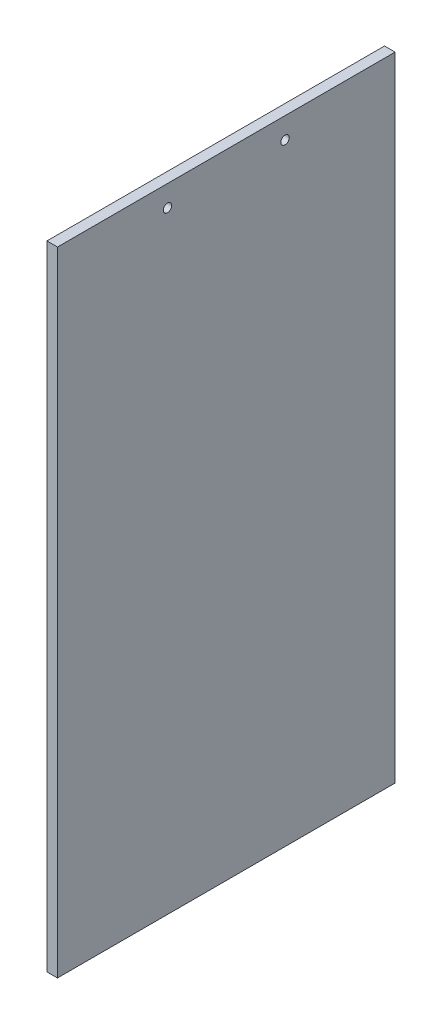
ISO-10303-21;
HEADER;
FILE_DESCRIPTION(('STEP AP214'),'2;1');
FILE_NAME('part.step','',(''),(''),'','','');
FILE_SCHEMA(('AUTOMOTIVE_DESIGN { 1 0 10303 214 1 1 1 1 }'));
ENDSEC;
DATA;
#1=APPLICATION_CONTEXT('core data for automotive mechanical design processes');
#2=APPLICATION_PROTOCOL_DEFINITION('international standard','automotive_design',2000,#1);
#3=PRODUCT_CONTEXT('',#1,'mechanical');
#4=PRODUCT('Part','Part','',(#3));
#5=PRODUCT_RELATED_PRODUCT_CATEGORY('part','',(#4));
#6=PRODUCT_DEFINITION_FORMATION('','',#4);
#7=PRODUCT_DEFINITION_CONTEXT('part definition',#1,'design');
#8=PRODUCT_DEFINITION('design','',#6,#7);
#9=PRODUCT_DEFINITION_SHAPE('','',#8);
#10=(LENGTH_UNIT() NAMED_UNIT(*) SI_UNIT(.MILLI.,.METRE.));
#11=(NAMED_UNIT(*) PLANE_ANGLE_UNIT() SI_UNIT($,.RADIAN.));
#12=(NAMED_UNIT(*) SI_UNIT($,.STERADIAN.) SOLID_ANGLE_UNIT());
#13=UNCERTAINTY_MEASURE_WITH_UNIT(LENGTH_MEASURE(1.E-05),#10,'distance_accuracy_value','');
#14=(GEOMETRIC_REPRESENTATION_CONTEXT(3) GLOBAL_UNCERTAINTY_ASSIGNED_CONTEXT((#13)) GLOBAL_UNIT_ASSIGNED_CONTEXT((#10,
#11,#12)) REPRESENTATION_CONTEXT('',''));
#15=CARTESIAN_POINT('',(0.,0.,0.));
#16=DIRECTION('',(0.,0.,1.));
#17=DIRECTION('',(1.,0.,0.));
#18=AXIS2_PLACEMENT_3D('',#15,#16,#17);
#19=CARTESIAN_POINT('',(5.,-300.,0.));
#20=DIRECTION('',(0.,1.,0.));
#21=DIRECTION('',(0.,0.,1.));
#22=AXIS2_PLACEMENT_3D('',#19,#20,#21);
#23=PLANE('',#22);
#24=DIRECTION('',(0.,0.,-1.));
#25=VECTOR('',#24,1.);
#26=CARTESIAN_POINT('',(0.,-300.,0.));
#27=LINE('',#26,#25);
#28=CARTESIAN_POINT('',(0.,-300.,-10.));
#29=VERTEX_POINT('',#28);
#30=CARTESIAN_POINT('',(0.,-300.,-170.));
#31=VERTEX_POINT('',#30);
#32=EDGE_CURVE('E94',#29,#31,#27,.T.);
#33=ORIENTED_EDGE('',*,*,#32,.T.);
#34=DIRECTION('',(1.,0.,0.));
#35=VECTOR('',#34,1.);
#36=CARTESIAN_POINT('',(-5.,-300.,-170.));
#37=LINE('',#36,#35);
#38=CARTESIAN_POINT('',(5.,-300.,-170.));
#39=VERTEX_POINT('',#38);
#40=EDGE_CURVE('E47',#31,#39,#37,.T.);
#41=ORIENTED_EDGE('',*,*,#40,.T.);
#42=DIRECTION('',(0.,0.,-1.));
#43=VECTOR('',#42,1.);
#44=CARTESIAN_POINT('',(5.,-300.,0.));
#45=LINE('',#44,#43);
#46=CARTESIAN_POINT('',(5.,-300.,-10.));
#47=VERTEX_POINT('',#46);
#48=EDGE_CURVE('E85',#47,#39,#45,.T.);
#49=ORIENTED_EDGE('',*,*,#48,.F.);
#50=DIRECTION('',(1.,0.,0.));
#51=VECTOR('',#50,1.);
#52=CARTESIAN_POINT('',(-5.,-300.,-10.));
#53=LINE('',#52,#51);
#54=EDGE_CURVE('E114',#29,#47,#53,.T.);
#55=ORIENTED_EDGE('',*,*,#54,.F.);
#56=EDGE_LOOP('',(#33,#41,#49,#55));
#57=FACE_BOUND('',#56,.T.);
#58=ADVANCED_FACE('F33',(#57),#23,.F.);
#59=CARTESIAN_POINT('',(5.,0.,0.));
#60=DIRECTION('',(0.,-1.,0.));
#61=DIRECTION('',(0.,0.,-1.));
#62=AXIS2_PLACEMENT_3D('',#59,#60,#61);
#63=PLANE('',#62);
#64=DIRECTION('',(0.,0.,1.));
#65=VECTOR('',#64,1.);
#66=CARTESIAN_POINT('',(5.,0.,0.));
#67=LINE('',#66,#65);
#68=CARTESIAN_POINT('',(5.,0.,-170.));
#69=VERTEX_POINT('',#68);
#70=CARTESIAN_POINT('',(5.,0.,-10.));
#71=VERTEX_POINT('',#70);
#72=EDGE_CURVE('E82',#69,#71,#67,.T.);
#73=ORIENTED_EDGE('',*,*,#72,.F.);
#74=DIRECTION('',(1.,0.,0.));
#75=VECTOR('',#74,1.);
#76=CARTESIAN_POINT('',(-5.,0.,-170.));
#77=LINE('',#76,#75);
#78=CARTESIAN_POINT('',(0.,0.,-170.));
#79=VERTEX_POINT('',#78);
#80=EDGE_CURVE('E71',#79,#69,#77,.T.);
#81=ORIENTED_EDGE('',*,*,#80,.F.);
#82=DIRECTION('',(0.,0.,1.));
#83=VECTOR('',#82,1.);
#84=CARTESIAN_POINT('',(0.,0.,0.));
#85=LINE('',#84,#83);
#86=CARTESIAN_POINT('',(0.,0.,-10.));
#87=VERTEX_POINT('',#86);
#88=EDGE_CURVE('E54',#79,#87,#85,.T.);
#89=ORIENTED_EDGE('',*,*,#88,.T.);
#90=DIRECTION('',(1.,0.,0.));
#91=VECTOR('',#90,1.);
#92=CARTESIAN_POINT('',(-5.,0.,-10.));
#93=LINE('',#92,#91);
#94=EDGE_CURVE('E88',#87,#71,#93,.T.);
#95=ORIENTED_EDGE('',*,*,#94,.T.);
#96=EDGE_LOOP('',(#73,#81,#89,#95));
#97=FACE_BOUND('',#96,.T.);
#98=ADVANCED_FACE('F87',(#97),#63,.F.);
#99=CARTESIAN_POINT('',(5.,0.,0.));
#100=DIRECTION('',(1.,0.,0.));
#101=DIRECTION('',(0.,0.,-1.));
#102=AXIS2_PLACEMENT_3D('',#99,#100,#101);
#103=PLANE('',#102);
#104=DIRECTION('',(0.,-1.,0.));
#105=VECTOR('',#104,1.);
#106=CARTESIAN_POINT('',(5.,0.,-170.));
#107=LINE('',#106,#105);
#108=EDGE_CURVE('E74',#69,#39,#107,.T.);
#109=ORIENTED_EDGE('',*,*,#108,.F.);
#110=ORIENTED_EDGE('',*,*,#72,.T.);
#111=DIRECTION('',(0.,1.,0.));
#112=VECTOR('',#111,1.);
#113=CARTESIAN_POINT('',(5.,0.,-10.));
#114=LINE('',#113,#112);
#115=EDGE_CURVE('E116',#47,#71,#114,.T.);
#116=ORIENTED_EDGE('',*,*,#115,.F.);
#117=ORIENTED_EDGE('',*,*,#48,.T.);
#118=EDGE_LOOP('',(#109,#110,#116,#117));
#119=FACE_BOUND('',#118,.T.);
#120=CARTESIAN_POINT('',(5.,-10.,-117.85));
#121=DIRECTION('',(1.,0.,0.));
#122=DIRECTION('',(0.,0.,-1.));
#123=AXIS2_PLACEMENT_3D('',#120,#121,#122);
#124=CIRCLE('',#123,2.);
#125=CARTESIAN_POINT('',(5.,-10.,-119.85));
#126=VERTEX_POINT('',#125);
#127=EDGE_CURVE('E111',#126,#126,#124,.T.);
#128=ORIENTED_EDGE('',*,*,#127,.F.);
#129=EDGE_LOOP('',(#128));
#130=FACE_BOUND('',#129,.T.);
#131=CARTESIAN_POINT('',(5.,-10.,-62.15));
#132=DIRECTION('',(1.,0.,0.));
#133=DIRECTION('',(0.,0.,-1.));
#134=AXIS2_PLACEMENT_3D('',#131,#132,#133);
#135=CIRCLE('',#134,2.);
#136=CARTESIAN_POINT('',(5.,-10.,-64.15));
#137=VERTEX_POINT('',#136);
#138=EDGE_CURVE('E102',#137,#137,#135,.T.);
#139=ORIENTED_EDGE('',*,*,#138,.F.);
#140=EDGE_LOOP('',(#139));
#141=FACE_BOUND('',#140,.T.);
#142=ADVANCED_FACE('F79',(#119,#130,#141),#103,.T.);
#143=CARTESIAN_POINT('',(0.,0.,0.));
#144=DIRECTION('',(1.,0.,0.));
#145=DIRECTION('',(0.,0.,-1.));
#146=AXIS2_PLACEMENT_3D('',#143,#144,#145);
#147=PLANE('',#146);
#148=CARTESIAN_POINT('',(0.,-10.,-117.85));
#149=DIRECTION('',(1.,0.,0.));
#150=DIRECTION('',(0.,0.,-1.));
#151=AXIS2_PLACEMENT_3D('',#148,#149,#150);
#152=CIRCLE('',#151,2.);
#153=CARTESIAN_POINT('',(0.,-10.,-119.85));
#154=VERTEX_POINT('',#153);
#155=EDGE_CURVE('E106',#154,#154,#152,.F.);
#156=ORIENTED_EDGE('',*,*,#155,.F.);
#157=EDGE_LOOP('',(#156));
#158=FACE_BOUND('',#157,.T.);
#159=CARTESIAN_POINT('',(0.,-10.,-62.15));
#160=DIRECTION('',(1.,0.,0.));
#161=DIRECTION('',(0.,0.,-1.));
#162=AXIS2_PLACEMENT_3D('',#159,#160,#161);
#163=CIRCLE('',#162,2.);
#164=CARTESIAN_POINT('',(0.,-10.,-64.15));
#165=VERTEX_POINT('',#164);
#166=EDGE_CURVE('E97',#165,#165,#163,.F.);
#167=ORIENTED_EDGE('',*,*,#166,.F.);
#168=EDGE_LOOP('',(#167));
#169=FACE_BOUND('',#168,.T.);
#170=ORIENTED_EDGE('',*,*,#88,.F.);
#171=DIRECTION('',(0.,-1.,0.));
#172=VECTOR('',#171,1.);
#173=CARTESIAN_POINT('',(0.,0.,-170.));
#174=LINE('',#173,#172);
#175=EDGE_CURVE('E11',#79,#31,#174,.T.);
#176=ORIENTED_EDGE('',*,*,#175,.T.);
#177=ORIENTED_EDGE('',*,*,#32,.F.);
#178=DIRECTION('',(0.,1.,0.));
#179=VECTOR('',#178,1.);
#180=CARTESIAN_POINT('',(0.,0.,-10.));
#181=LINE('',#180,#179);
#182=EDGE_CURVE('E40',#29,#87,#181,.T.);
#183=ORIENTED_EDGE('',*,*,#182,.T.);
#184=EDGE_LOOP('',(#170,#176,#177,#183));
#185=FACE_BOUND('',#184,.T.);
#186=ADVANCED_FACE('F121',(#158,#169,#185),#147,.F.);
#187=CARTESIAN_POINT('',(-0.00100000000000013,-10.,-62.15));
#188=DIRECTION('',(1.,0.,0.));
#189=DIRECTION('',(0.,0.,-1.));
#190=AXIS2_PLACEMENT_3D('',#187,#188,#189);
#191=CYLINDRICAL_SURFACE('',#190,2.);
#192=ORIENTED_EDGE('',*,*,#138,.T.);
#193=EDGE_LOOP('',(#192));
#194=FACE_BOUND('',#193,.T.);
#195=ORIENTED_EDGE('',*,*,#166,.T.);
#196=EDGE_LOOP('',(#195));
#197=FACE_BOUND('',#196,.T.);
#198=ADVANCED_FACE('F131',(#194,#197),#191,.F.);
#199=CARTESIAN_POINT('',(-0.00100000000000013,-10.,-117.85));
#200=DIRECTION('',(1.,0.,0.));
#201=DIRECTION('',(0.,0.,-1.));
#202=AXIS2_PLACEMENT_3D('',#199,#200,#201);
#203=CYLINDRICAL_SURFACE('',#202,2.);
#204=ORIENTED_EDGE('',*,*,#127,.T.);
#205=EDGE_LOOP('',(#204));
#206=FACE_BOUND('',#205,.T.);
#207=ORIENTED_EDGE('',*,*,#155,.T.);
#208=EDGE_LOOP('',(#207));
#209=FACE_BOUND('',#208,.T.);
#210=ADVANCED_FACE('F124',(#206,#209),#203,.F.);
#211=CARTESIAN_POINT('',(-5.,0.,-10.));
#212=DIRECTION('',(0.,0.,-1.));
#213=DIRECTION('',(0.,1.,0.));
#214=AXIS2_PLACEMENT_3D('',#211,#212,#213);
#215=PLANE('',#214);
#216=ORIENTED_EDGE('',*,*,#54,.T.);
#217=ORIENTED_EDGE('',*,*,#115,.T.);
#218=ORIENTED_EDGE('',*,*,#94,.F.);
#219=ORIENTED_EDGE('',*,*,#182,.F.);
#220=EDGE_LOOP('',(#216,#217,#218,#219));
#221=FACE_BOUND('',#220,.T.);
#222=ADVANCED_FACE('F122',(#221),#215,.F.);
#223=CARTESIAN_POINT('',(-5.,0.,-170.));
#224=DIRECTION('',(0.,0.,1.));
#225=DIRECTION('',(0.,-1.,0.));
#226=AXIS2_PLACEMENT_3D('',#223,#224,#225);
#227=PLANE('',#226);
#228=ORIENTED_EDGE('',*,*,#80,.T.);
#229=ORIENTED_EDGE('',*,*,#108,.T.);
#230=ORIENTED_EDGE('',*,*,#40,.F.);
#231=ORIENTED_EDGE('',*,*,#175,.F.);
#232=EDGE_LOOP('',(#228,#229,#230,#231));
#233=FACE_BOUND('',#232,.T.);
#234=ADVANCED_FACE('F73',(#233),#227,.F.);
#235=CLOSED_SHELL('',(#58,#98,#142,#186,#198,#210,#222,#234));
#236=MANIFOLD_SOLID_BREP('B2',#235);
#237=ADVANCED_BREP_SHAPE_REPRESENTATION('',(#18,#236),#14);
#238=SHAPE_DEFINITION_REPRESENTATION(#9,#237);
ENDSEC;
END-ISO-10303-21;
